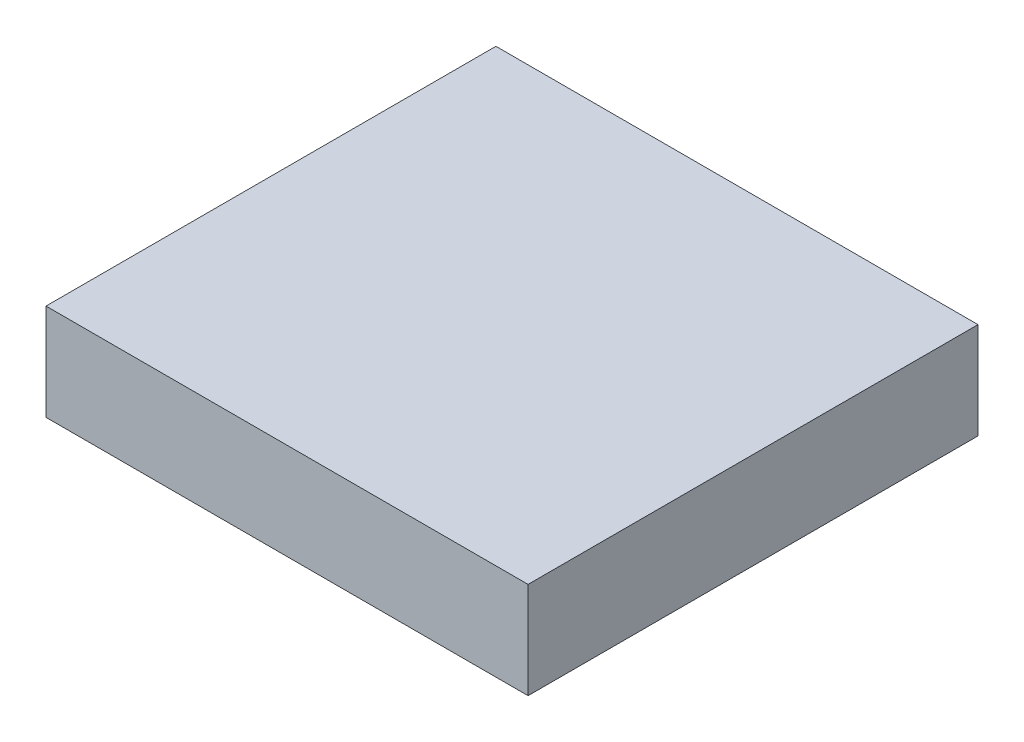
ISO-10303-21;
HEADER;
FILE_DESCRIPTION(('STEP AP214'),'2;1');
FILE_NAME('part.step','',(''),(''),'','','');
FILE_SCHEMA(('AUTOMOTIVE_DESIGN { 1 0 10303 214 1 1 1 1 }'));
ENDSEC;
DATA;
#1=APPLICATION_CONTEXT('core data for automotive mechanical design processes');
#2=APPLICATION_PROTOCOL_DEFINITION('international standard','automotive_design',2000,#1);
#3=PRODUCT_CONTEXT('',#1,'mechanical');
#4=PRODUCT('Part','Part','',(#3));
#5=PRODUCT_RELATED_PRODUCT_CATEGORY('part','',(#4));
#6=PRODUCT_DEFINITION_FORMATION('','',#4);
#7=PRODUCT_DEFINITION_CONTEXT('part definition',#1,'design');
#8=PRODUCT_DEFINITION('design','',#6,#7);
#9=PRODUCT_DEFINITION_SHAPE('','',#8);
#10=(LENGTH_UNIT() NAMED_UNIT(*) SI_UNIT(.MILLI.,.METRE.));
#11=(NAMED_UNIT(*) PLANE_ANGLE_UNIT() SI_UNIT($,.RADIAN.));
#12=(NAMED_UNIT(*) SI_UNIT($,.STERADIAN.) SOLID_ANGLE_UNIT());
#13=UNCERTAINTY_MEASURE_WITH_UNIT(LENGTH_MEASURE(1.E-05),#10,'distance_accuracy_value','');
#14=(GEOMETRIC_REPRESENTATION_CONTEXT(3) GLOBAL_UNCERTAINTY_ASSIGNED_CONTEXT((#13)) GLOBAL_UNIT_ASSIGNED_CONTEXT((#10,
#11,#12)) REPRESENTATION_CONTEXT('',''));
#15=CARTESIAN_POINT('',(0.,0.,0.));
#16=DIRECTION('',(0.,0.,1.));
#17=DIRECTION('',(1.,0.,0.));
#18=AXIS2_PLACEMENT_3D('',#15,#16,#17);
#19=CARTESIAN_POINT('',(75.,15.,70.));
#20=DIRECTION('',(-1.,0.,0.));
#21=DIRECTION('',(0.,0.,1.));
#22=AXIS2_PLACEMENT_3D('',#19,#20,#21);
#23=PLANE('',#22);
#24=DIRECTION('',(0.,0.,-1.));
#25=VECTOR('',#24,1.);
#26=CARTESIAN_POINT('',(75.,-15.,70.));
#27=LINE('',#26,#25);
#28=CARTESIAN_POINT('',(75.,-15.,70.));
#29=VERTEX_POINT('',#28);
#30=CARTESIAN_POINT('',(75.,-15.,-70.));
#31=VERTEX_POINT('',#30);
#32=EDGE_CURVE('E101',#29,#31,#27,.T.);
#33=ORIENTED_EDGE('',*,*,#32,.T.);
#34=DIRECTION('',(0.,-1.,0.));
#35=VECTOR('',#34,1.);
#36=CARTESIAN_POINT('',(75.,15.,-70.));
#37=LINE('',#36,#35);
#38=CARTESIAN_POINT('',(75.,15.,-70.));
#39=VERTEX_POINT('',#38);
#40=EDGE_CURVE('E11',#39,#31,#37,.T.);
#41=ORIENTED_EDGE('',*,*,#40,.F.);
#42=DIRECTION('',(0.,0.,-1.));
#43=VECTOR('',#42,1.);
#44=CARTESIAN_POINT('',(75.,15.,70.));
#45=LINE('',#44,#43);
#46=CARTESIAN_POINT('',(75.,15.,70.));
#47=VERTEX_POINT('',#46);
#48=EDGE_CURVE('E89',#47,#39,#45,.T.);
#49=ORIENTED_EDGE('',*,*,#48,.F.);
#50=DIRECTION('',(0.,-1.,0.));
#51=VECTOR('',#50,1.);
#52=CARTESIAN_POINT('',(75.,15.,70.));
#53=LINE('',#52,#51);
#54=EDGE_CURVE('E97',#47,#29,#53,.T.);
#55=ORIENTED_EDGE('',*,*,#54,.T.);
#56=EDGE_LOOP('',(#33,#41,#49,#55));
#57=FACE_BOUND('',#56,.T.);
#58=ADVANCED_FACE('F38',(#57),#23,.F.);
#59=CARTESIAN_POINT('',(-75.,15.,-70.));
#60=DIRECTION('',(0.,0.,1.));
#61=DIRECTION('',(1.,0.,0.));
#62=AXIS2_PLACEMENT_3D('',#59,#60,#61);
#63=PLANE('',#62);
#64=DIRECTION('',(-1.,0.,0.));
#65=VECTOR('',#64,1.);
#66=CARTESIAN_POINT('',(-75.,-15.,-70.));
#67=LINE('',#66,#65);
#68=CARTESIAN_POINT('',(-75.,-15.,-70.));
#69=VERTEX_POINT('',#68);
#70=EDGE_CURVE('E93',#31,#69,#67,.T.);
#71=ORIENTED_EDGE('',*,*,#70,.T.);
#72=DIRECTION('',(0.,-1.,0.));
#73=VECTOR('',#72,1.);
#74=CARTESIAN_POINT('',(-75.,15.,-70.));
#75=LINE('',#74,#73);
#76=CARTESIAN_POINT('',(-75.,15.,-70.));
#77=VERTEX_POINT('',#76);
#78=EDGE_CURVE('E46',#77,#69,#75,.T.);
#79=ORIENTED_EDGE('',*,*,#78,.F.);
#80=DIRECTION('',(-1.,0.,0.));
#81=VECTOR('',#80,1.);
#82=CARTESIAN_POINT('',(-75.,15.,-70.));
#83=LINE('',#82,#81);
#84=EDGE_CURVE('E84',#39,#77,#83,.T.);
#85=ORIENTED_EDGE('',*,*,#84,.F.);
#86=ORIENTED_EDGE('',*,*,#40,.T.);
#87=EDGE_LOOP('',(#71,#79,#85,#86));
#88=FACE_BOUND('',#87,.T.);
#89=ADVANCED_FACE('F92',(#88),#63,.F.);
#90=CARTESIAN_POINT('',(-75.,15.,70.));
#91=DIRECTION('',(1.,0.,0.));
#92=DIRECTION('',(0.,0.,-1.));
#93=AXIS2_PLACEMENT_3D('',#90,#91,#92);
#94=PLANE('',#93);
#95=DIRECTION('',(0.,0.,1.));
#96=VECTOR('',#95,1.);
#97=CARTESIAN_POINT('',(-75.,-15.,70.));
#98=LINE('',#97,#96);
#99=CARTESIAN_POINT('',(-75.,-15.,70.));
#100=VERTEX_POINT('',#99);
#101=EDGE_CURVE('E71',#69,#100,#98,.T.);
#102=ORIENTED_EDGE('',*,*,#101,.T.);
#103=DIRECTION('',(0.,-1.,0.));
#104=VECTOR('',#103,1.);
#105=CARTESIAN_POINT('',(-75.,15.,70.));
#106=LINE('',#105,#104);
#107=CARTESIAN_POINT('',(-75.,15.,70.));
#108=VERTEX_POINT('',#107);
#109=EDGE_CURVE('E94',#108,#100,#106,.T.);
#110=ORIENTED_EDGE('',*,*,#109,.F.);
#111=DIRECTION('',(0.,0.,1.));
#112=VECTOR('',#111,1.);
#113=CARTESIAN_POINT('',(-75.,15.,70.));
#114=LINE('',#113,#112);
#115=EDGE_CURVE('E87',#77,#108,#114,.T.);
#116=ORIENTED_EDGE('',*,*,#115,.F.);
#117=ORIENTED_EDGE('',*,*,#78,.T.);
#118=EDGE_LOOP('',(#102,#110,#116,#117));
#119=FACE_BOUND('',#118,.T.);
#120=ADVANCED_FACE('F95',(#119),#94,.F.);
#121=CARTESIAN_POINT('',(-75.,15.,70.));
#122=DIRECTION('',(0.,0.,-1.));
#123=DIRECTION('',(-1.,0.,0.));
#124=AXIS2_PLACEMENT_3D('',#121,#122,#123);
#125=PLANE('',#124);
#126=DIRECTION('',(1.,0.,0.));
#127=VECTOR('',#126,1.);
#128=CARTESIAN_POINT('',(-75.,-15.,70.));
#129=LINE('',#128,#127);
#130=EDGE_CURVE('E77',#100,#29,#129,.T.);
#131=ORIENTED_EDGE('',*,*,#130,.T.);
#132=ORIENTED_EDGE('',*,*,#54,.F.);
#133=DIRECTION('',(1.,0.,0.));
#134=VECTOR('',#133,1.);
#135=CARTESIAN_POINT('',(-75.,15.,70.));
#136=LINE('',#135,#134);
#137=EDGE_CURVE('E54',#108,#47,#136,.T.);
#138=ORIENTED_EDGE('',*,*,#137,.F.);
#139=ORIENTED_EDGE('',*,*,#109,.T.);
#140=EDGE_LOOP('',(#131,#132,#138,#139));
#141=FACE_BOUND('',#140,.T.);
#142=ADVANCED_FACE('F108',(#141),#125,.F.);
#143=CARTESIAN_POINT('',(0.,15.,0.));
#144=DIRECTION('',(0.,-1.,0.));
#145=DIRECTION('',(0.,0.,-1.));
#146=AXIS2_PLACEMENT_3D('',#143,#144,#145);
#147=PLANE('',#146);
#148=ORIENTED_EDGE('',*,*,#48,.T.);
#149=ORIENTED_EDGE('',*,*,#84,.T.);
#150=ORIENTED_EDGE('',*,*,#115,.T.);
#151=ORIENTED_EDGE('',*,*,#137,.T.);
#152=EDGE_LOOP('',(#148,#149,#150,#151));
#153=FACE_BOUND('',#152,.T.);
#154=ADVANCED_FACE('F85',(#153),#147,.F.);
#155=CARTESIAN_POINT('',(0.,-15.,0.));
#156=DIRECTION('',(0.,-1.,0.));
#157=DIRECTION('',(0.,0.,-1.));
#158=AXIS2_PLACEMENT_3D('',#155,#156,#157);
#159=PLANE('',#158);
#160=ORIENTED_EDGE('',*,*,#32,.F.);
#161=ORIENTED_EDGE('',*,*,#130,.F.);
#162=ORIENTED_EDGE('',*,*,#101,.F.);
#163=ORIENTED_EDGE('',*,*,#70,.F.);
#164=EDGE_LOOP('',(#160,#161,#162,#163));
#165=FACE_BOUND('',#164,.T.);
#166=ADVANCED_FACE('F111',(#165),#159,.T.);
#167=CLOSED_SHELL('',(#58,#89,#120,#142,#154,#166));
#168=MANIFOLD_SOLID_BREP('B2',#167);
#169=ADVANCED_BREP_SHAPE_REPRESENTATION('',(#18,#168),#14);
#170=SHAPE_DEFINITION_REPRESENTATION(#9,#169);
ENDSEC;
END-ISO-10303-21;
